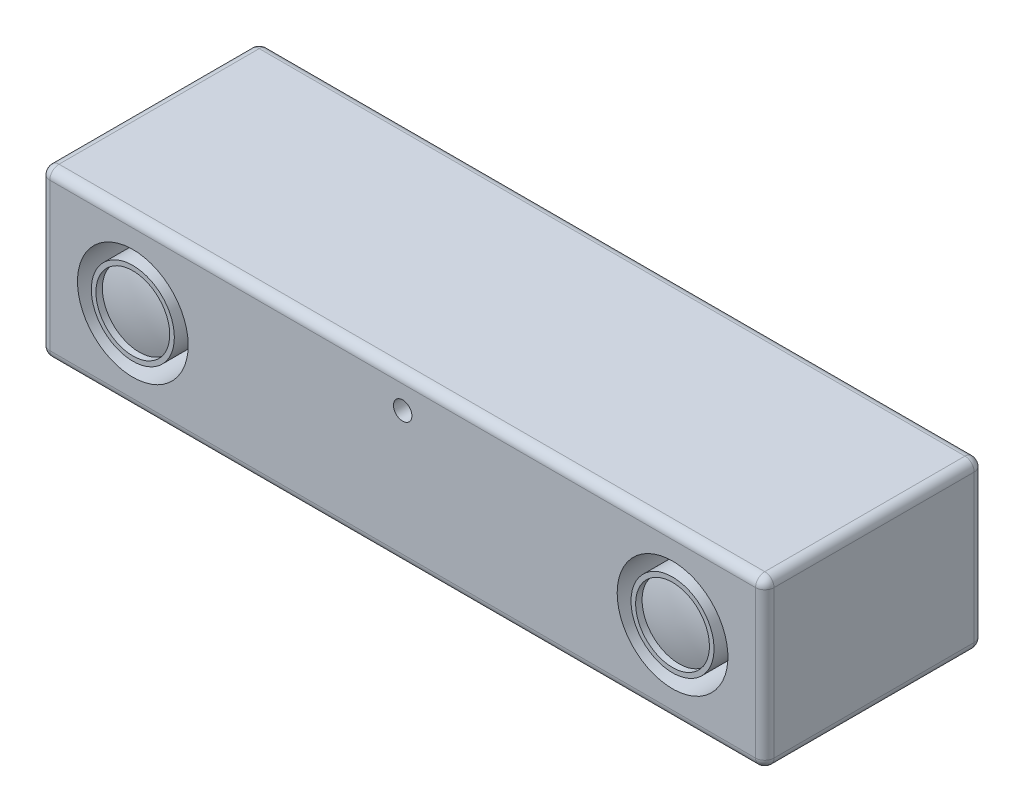
ISO-10303-21;
HEADER;
FILE_DESCRIPTION(('STEP AP214'),'2;1');
FILE_NAME('part.step','',(''),(''),'','','');
FILE_SCHEMA(('AUTOMOTIVE_DESIGN { 1 0 10303 214 1 1 1 1 }'));
ENDSEC;
DATA;
#1=APPLICATION_CONTEXT('core data for automotive mechanical design processes');
#2=APPLICATION_PROTOCOL_DEFINITION('international standard','automotive_design',2000,#1);
#3=PRODUCT_CONTEXT('',#1,'mechanical');
#4=PRODUCT('Part','Part','',(#3));
#5=PRODUCT_RELATED_PRODUCT_CATEGORY('part','',(#4));
#6=PRODUCT_DEFINITION_FORMATION('','',#4);
#7=PRODUCT_DEFINITION_CONTEXT('part definition',#1,'design');
#8=PRODUCT_DEFINITION('design','',#6,#7);
#9=PRODUCT_DEFINITION_SHAPE('','',#8);
#10=(LENGTH_UNIT() NAMED_UNIT(*) SI_UNIT(.MILLI.,.METRE.));
#11=(NAMED_UNIT(*) PLANE_ANGLE_UNIT() SI_UNIT($,.RADIAN.));
#12=(NAMED_UNIT(*) SI_UNIT($,.STERADIAN.) SOLID_ANGLE_UNIT());
#13=UNCERTAINTY_MEASURE_WITH_UNIT(LENGTH_MEASURE(1.E-05),#10,'distance_accuracy_value','');
#14=(GEOMETRIC_REPRESENTATION_CONTEXT(3) GLOBAL_UNCERTAINTY_ASSIGNED_CONTEXT((#13)) GLOBAL_UNIT_ASSIGNED_CONTEXT((#10,
#11,#12)) REPRESENTATION_CONTEXT('',''));
#15=CARTESIAN_POINT('',(0.,0.,0.));
#16=DIRECTION('',(0.,0.,1.));
#17=DIRECTION('',(1.,0.,0.));
#18=AXIS2_PLACEMENT_3D('',#15,#16,#17);
#19=CARTESIAN_POINT('',(78.5,36.,-23.7));
#20=DIRECTION('',(-1.,0.,0.));
#21=DIRECTION('',(0.,0.,1.));
#22=AXIS2_PLACEMENT_3D('',#19,#20,#21);
#23=PLANE('',#22);
#24=DIRECTION('',(0.,-1.,0.));
#25=VECTOR('',#24,1.);
#26=CARTESIAN_POINT('',(78.5,36.,21.7));
#27=LINE('',#26,#25);
#28=CARTESIAN_POINT('',(78.5,34.,21.7));
#29=VERTEX_POINT('',#28);
#30=CARTESIAN_POINT('',(78.5,2.,21.7));
#31=VERTEX_POINT('',#30);
#32=EDGE_CURVE('E283',#29,#31,#27,.T.);
#33=ORIENTED_EDGE('',*,*,#32,.T.);
#34=DIRECTION('',(0.,0.,-1.));
#35=VECTOR('',#34,1.);
#36=CARTESIAN_POINT('',(78.5,2.,-23.7));
#37=LINE('',#36,#35);
#38=CARTESIAN_POINT('',(78.5,2.,-21.7));
#39=VERTEX_POINT('',#38);
#40=EDGE_CURVE('E219',#31,#39,#37,.T.);
#41=ORIENTED_EDGE('',*,*,#40,.T.);
#42=DIRECTION('',(0.,-1.,0.));
#43=VECTOR('',#42,1.);
#44=CARTESIAN_POINT('',(78.5,36.,-21.7));
#45=LINE('',#44,#43);
#46=CARTESIAN_POINT('',(78.5,34.,-21.7));
#47=VERTEX_POINT('',#46);
#48=EDGE_CURVE('E281',#39,#47,#45,.F.);
#49=ORIENTED_EDGE('',*,*,#48,.T.);
#50=DIRECTION('',(0.,0.,-1.));
#51=VECTOR('',#50,1.);
#52=CARTESIAN_POINT('',(78.5,34.,23.7));
#53=LINE('',#52,#51);
#54=EDGE_CURVE('E213',#47,#29,#53,.F.);
#55=ORIENTED_EDGE('',*,*,#54,.T.);
#56=EDGE_LOOP('',(#33,#41,#49,#55));
#57=FACE_BOUND('',#56,.T.);
#58=ADVANCED_FACE('F35',(#57),#23,.F.);
#59=CARTESIAN_POINT('',(-78.5,36.,-23.7));
#60=DIRECTION('',(0.,0.,1.));
#61=DIRECTION('',(1.,0.,0.));
#62=AXIS2_PLACEMENT_3D('',#59,#60,#61);
#63=PLANE('',#62);
#64=DIRECTION('',(-1.,0.,0.));
#65=VECTOR('',#64,1.);
#66=CARTESIAN_POINT('',(-78.5,2.,-23.7));
#67=LINE('',#66,#65);
#68=CARTESIAN_POINT('',(76.5,2.,-23.7));
#69=VERTEX_POINT('',#68);
#70=CARTESIAN_POINT('',(-76.5,2.,-23.7));
#71=VERTEX_POINT('',#70);
#72=EDGE_CURVE('E255',#69,#71,#67,.T.);
#73=ORIENTED_EDGE('',*,*,#72,.T.);
#74=DIRECTION('',(0.,-1.,0.));
#75=VECTOR('',#74,1.);
#76=CARTESIAN_POINT('',(-76.5,36.,-23.7));
#77=LINE('',#76,#75);
#78=CARTESIAN_POINT('',(-76.5,34.,-23.7));
#79=VERTEX_POINT('',#78);
#80=EDGE_CURVE('E252',#71,#79,#77,.F.);
#81=ORIENTED_EDGE('',*,*,#80,.T.);
#82=DIRECTION('',(-1.,0.,0.));
#83=VECTOR('',#82,1.);
#84=CARTESIAN_POINT('',(78.5,34.,-23.7));
#85=LINE('',#84,#83);
#86=CARTESIAN_POINT('',(76.5,34.,-23.7));
#87=VERTEX_POINT('',#86);
#88=EDGE_CURVE('E244',#79,#87,#85,.F.);
#89=ORIENTED_EDGE('',*,*,#88,.T.);
#90=DIRECTION('',(0.,-1.,0.));
#91=VECTOR('',#90,1.);
#92=CARTESIAN_POINT('',(76.5,36.,-23.7));
#93=LINE('',#92,#91);
#94=EDGE_CURVE('E249',#87,#69,#93,.T.);
#95=ORIENTED_EDGE('',*,*,#94,.T.);
#96=EDGE_LOOP('',(#73,#81,#89,#95));
#97=FACE_BOUND('',#96,.T.);
#98=ADVANCED_FACE('F253',(#97),#63,.F.);
#99=CARTESIAN_POINT('',(-78.5,36.,-23.7));
#100=DIRECTION('',(1.,0.,0.));
#101=DIRECTION('',(0.,0.,-1.));
#102=AXIS2_PLACEMENT_3D('',#99,#100,#101);
#103=PLANE('',#102);
#104=DIRECTION('',(0.,0.,1.));
#105=VECTOR('',#104,1.);
#106=CARTESIAN_POINT('',(-78.5,34.,-23.7));
#107=LINE('',#106,#105);
#108=CARTESIAN_POINT('',(-78.5,34.,21.7));
#109=VERTEX_POINT('',#108);
#110=CARTESIAN_POINT('',(-78.5,34.,-21.7));
#111=VERTEX_POINT('',#110);
#112=EDGE_CURVE('E134',#109,#111,#107,.F.);
#113=ORIENTED_EDGE('',*,*,#112,.T.);
#114=DIRECTION('',(0.,-1.,0.));
#115=VECTOR('',#114,1.);
#116=CARTESIAN_POINT('',(-78.5,36.,-21.7));
#117=LINE('',#116,#115);
#118=CARTESIAN_POINT('',(-78.5,2.,-21.7));
#119=VERTEX_POINT('',#118);
#120=EDGE_CURVE('E130',#111,#119,#117,.T.);
#121=ORIENTED_EDGE('',*,*,#120,.T.);
#122=DIRECTION('',(0.,0.,1.));
#123=VECTOR('',#122,1.);
#124=CARTESIAN_POINT('',(-78.5,2.,-23.7));
#125=LINE('',#124,#123);
#126=CARTESIAN_POINT('',(-78.5,2.,21.7));
#127=VERTEX_POINT('',#126);
#128=EDGE_CURVE('E124',#119,#127,#125,.T.);
#129=ORIENTED_EDGE('',*,*,#128,.T.);
#130=DIRECTION('',(0.,-1.,0.));
#131=VECTOR('',#130,1.);
#132=CARTESIAN_POINT('',(-78.5,36.,21.7));
#133=LINE('',#132,#131);
#134=EDGE_CURVE('E127',#127,#109,#133,.F.);
#135=ORIENTED_EDGE('',*,*,#134,.T.);
#136=EDGE_LOOP('',(#113,#121,#129,#135));
#137=FACE_BOUND('',#136,.T.);
#138=ADVANCED_FACE('F126',(#137),#103,.F.);
#139=CARTESIAN_POINT('',(-78.5,36.,23.7));
#140=DIRECTION('',(0.,0.,-1.));
#141=DIRECTION('',(-1.,0.,0.));
#142=AXIS2_PLACEMENT_3D('',#139,#140,#141);
#143=PLANE('',#142);
#144=CARTESIAN_POINT('',(58.5,18.,23.7));
#145=DIRECTION('',(0.,0.,1.));
#146=DIRECTION('',(-1.,0.,0.));
#147=AXIS2_PLACEMENT_3D('',#144,#145,#146);
#148=CIRCLE('',#147,12.);
#149=CARTESIAN_POINT('',(46.5,18.,23.7));
#150=VERTEX_POINT('',#149);
#151=EDGE_CURVE('E680',#150,#150,#148,.T.);
#152=ORIENTED_EDGE('',*,*,#151,.F.);
#153=EDGE_LOOP('',(#152));
#154=FACE_BOUND('',#153,.T.);
#155=CARTESIAN_POINT('',(-58.5,18.,23.7));
#156=DIRECTION('',(0.,0.,1.));
#157=DIRECTION('',(1.,0.,0.));
#158=AXIS2_PLACEMENT_3D('',#155,#156,#157);
#159=CIRCLE('',#158,12.);
#160=CARTESIAN_POINT('',(-46.5,18.,23.7));
#161=VERTEX_POINT('',#160);
#162=EDGE_CURVE('E694',#161,#161,#159,.T.);
#163=ORIENTED_EDGE('',*,*,#162,.F.);
#164=EDGE_LOOP('',(#163));
#165=FACE_BOUND('',#164,.T.);
#166=CARTESIAN_POINT('',(0.,29.,23.7));
#167=DIRECTION('',(0.,0.,1.));
#168=DIRECTION('',(1.,0.,0.));
#169=AXIS2_PLACEMENT_3D('',#166,#167,#168);
#170=CIRCLE('',#169,2.);
#171=CARTESIAN_POINT('',(2.,29.,23.7));
#172=VERTEX_POINT('',#171);
#173=EDGE_CURVE('E674',#172,#172,#170,.T.);
#174=ORIENTED_EDGE('',*,*,#173,.F.);
#175=EDGE_LOOP('',(#174));
#176=FACE_BOUND('',#175,.T.);
#177=DIRECTION('',(0.,-1.,0.));
#178=VECTOR('',#177,1.);
#179=CARTESIAN_POINT('',(-76.5,36.,23.7));
#180=LINE('',#179,#178);
#181=CARTESIAN_POINT('',(-76.5,34.,23.7));
#182=VERTEX_POINT('',#181);
#183=CARTESIAN_POINT('',(-76.5,2.,23.7));
#184=VERTEX_POINT('',#183);
#185=EDGE_CURVE('E275',#182,#184,#180,.T.);
#186=ORIENTED_EDGE('',*,*,#185,.T.);
#187=DIRECTION('',(1.,0.,0.));
#188=VECTOR('',#187,1.);
#189=CARTESIAN_POINT('',(-78.5,2.,23.7));
#190=LINE('',#189,#188);
#191=CARTESIAN_POINT('',(76.5,2.,23.7));
#192=VERTEX_POINT('',#191);
#193=EDGE_CURVE('E277',#184,#192,#190,.T.);
#194=ORIENTED_EDGE('',*,*,#193,.T.);
#195=DIRECTION('',(0.,-1.,0.));
#196=VECTOR('',#195,1.);
#197=CARTESIAN_POINT('',(76.5,36.,23.7));
#198=LINE('',#197,#196);
#199=CARTESIAN_POINT('',(76.5,34.,23.7));
#200=VERTEX_POINT('',#199);
#201=EDGE_CURVE('E273',#192,#200,#198,.F.);
#202=ORIENTED_EDGE('',*,*,#201,.T.);
#203=DIRECTION('',(1.,0.,0.));
#204=VECTOR('',#203,1.);
#205=CARTESIAN_POINT('',(-78.5,34.,23.7));
#206=LINE('',#205,#204);
#207=EDGE_CURVE('E271',#200,#182,#206,.F.);
#208=ORIENTED_EDGE('',*,*,#207,.T.);
#209=EDGE_LOOP('',(#186,#194,#202,#208));
#210=FACE_BOUND('',#209,.T.);
#211=ADVANCED_FACE('F456',(#154,#165,#176,#210),#143,.F.);
#212=CARTESIAN_POINT('',(0.,36.,0.));
#213=DIRECTION('',(0.,1.,0.));
#214=DIRECTION('',(0.,0.,1.));
#215=AXIS2_PLACEMENT_3D('',#212,#213,#214);
#216=PLANE('',#215);
#217=DIRECTION('',(-1.,0.,0.));
#218=VECTOR('',#217,1.);
#219=CARTESIAN_POINT('',(-78.5,36.,-21.7));
#220=LINE('',#219,#218);
#221=CARTESIAN_POINT('',(76.5,36.,-21.7));
#222=VERTEX_POINT('',#221);
#223=CARTESIAN_POINT('',(-76.5,36.,-21.7));
#224=VERTEX_POINT('',#223);
#225=EDGE_CURVE('E44',#222,#224,#220,.T.);
#226=ORIENTED_EDGE('',*,*,#225,.T.);
#227=DIRECTION('',(0.,0.,1.));
#228=VECTOR('',#227,1.);
#229=CARTESIAN_POINT('',(-76.5,36.,23.7));
#230=LINE('',#229,#228);
#231=CARTESIAN_POINT('',(-76.5,36.,21.7));
#232=VERTEX_POINT('',#231);
#233=EDGE_CURVE('E11',#224,#232,#230,.T.);
#234=ORIENTED_EDGE('',*,*,#233,.T.);
#235=DIRECTION('',(1.,0.,0.));
#236=VECTOR('',#235,1.);
#237=CARTESIAN_POINT('',(78.5,36.,21.7));
#238=LINE('',#237,#236);
#239=CARTESIAN_POINT('',(76.5,36.,21.7));
#240=VERTEX_POINT('',#239);
#241=EDGE_CURVE('E216',#232,#240,#238,.T.);
#242=ORIENTED_EDGE('',*,*,#241,.T.);
#243=DIRECTION('',(0.,0.,-1.));
#244=VECTOR('',#243,1.);
#245=CARTESIAN_POINT('',(76.5,36.,-23.7));
#246=LINE('',#245,#244);
#247=EDGE_CURVE('E55',#240,#222,#246,.T.);
#248=ORIENTED_EDGE('',*,*,#247,.T.);
#249=EDGE_LOOP('',(#226,#234,#242,#248));
#250=FACE_BOUND('',#249,.T.);
#251=ADVANCED_FACE('F542',(#250),#216,.T.);
#252=CARTESIAN_POINT('',(0.,0.,0.));
#253=DIRECTION('',(0.,1.,0.));
#254=DIRECTION('',(0.,0.,1.));
#255=AXIS2_PLACEMENT_3D('',#252,#253,#254);
#256=PLANE('',#255);
#257=DIRECTION('',(0.,0.,1.));
#258=VECTOR('',#257,1.);
#259=CARTESIAN_POINT('',(-76.5,0.,0.));
#260=LINE('',#259,#258);
#261=CARTESIAN_POINT('',(-76.5,0.,21.7));
#262=VERTEX_POINT('',#261);
#263=CARTESIAN_POINT('',(-76.5,0.,-21.7));
#264=VERTEX_POINT('',#263);
#265=EDGE_CURVE('E156',#262,#264,#260,.F.);
#266=ORIENTED_EDGE('',*,*,#265,.T.);
#267=DIRECTION('',(-1.,0.,0.));
#268=VECTOR('',#267,1.);
#269=CARTESIAN_POINT('',(0.,0.,-21.7));
#270=LINE('',#269,#268);
#271=CARTESIAN_POINT('',(76.5,0.,-21.7));
#272=VERTEX_POINT('',#271);
#273=EDGE_CURVE('E268',#264,#272,#270,.F.);
#274=ORIENTED_EDGE('',*,*,#273,.T.);
#275=DIRECTION('',(0.,0.,-1.));
#276=VECTOR('',#275,1.);
#277=CARTESIAN_POINT('',(76.5,0.,0.));
#278=LINE('',#277,#276);
#279=CARTESIAN_POINT('',(76.5,0.,21.7));
#280=VERTEX_POINT('',#279);
#281=EDGE_CURVE('E259',#272,#280,#278,.F.);
#282=ORIENTED_EDGE('',*,*,#281,.T.);
#283=DIRECTION('',(1.,0.,0.));
#284=VECTOR('',#283,1.);
#285=CARTESIAN_POINT('',(0.,0.,21.7));
#286=LINE('',#285,#284);
#287=EDGE_CURVE('E261',#280,#262,#286,.F.);
#288=ORIENTED_EDGE('',*,*,#287,.T.);
#289=EDGE_LOOP('',(#266,#274,#282,#288));
#290=FACE_BOUND('',#289,.T.);
#291=ADVANCED_FACE('F556',(#290),#256,.F.);
#292=CARTESIAN_POINT('',(76.5,36.,21.7));
#293=DIRECTION('',(0.,-1.,0.));
#294=DIRECTION('',(0.,0.,-1.));
#295=AXIS2_PLACEMENT_3D('',#292,#293,#294);
#296=CYLINDRICAL_SURFACE('',#295,2.);
#297=CARTESIAN_POINT('',(76.5,34.,21.7));
#298=DIRECTION('',(0.,1.,0.));
#299=DIRECTION('',(0.,0.,1.));
#300=AXIS2_PLACEMENT_3D('',#297,#298,#299);
#301=CIRCLE('',#300,2.);
#302=EDGE_CURVE('E39',#200,#29,#301,.T.);
#303=ORIENTED_EDGE('',*,*,#302,.F.);
#304=ORIENTED_EDGE('',*,*,#201,.F.);
#305=CARTESIAN_POINT('',(76.5,2.,21.7));
#306=DIRECTION('',(0.,-1.,0.));
#307=DIRECTION('',(0.,0.,-1.));
#308=AXIS2_PLACEMENT_3D('',#305,#306,#307);
#309=CIRCLE('',#308,2.);
#310=EDGE_CURVE('E194',#31,#192,#309,.T.);
#311=ORIENTED_EDGE('',*,*,#310,.F.);
#312=ORIENTED_EDGE('',*,*,#32,.F.);
#313=EDGE_LOOP('',(#303,#304,#311,#312));
#314=FACE_BOUND('',#313,.T.);
#315=ADVANCED_FACE('F37',(#314),#296,.T.);
#316=CARTESIAN_POINT('',(76.5,34.,21.7));
#317=DIRECTION('',(0.,0.,1.));
#318=DIRECTION('',(1.,0.,0.));
#319=AXIS2_PLACEMENT_3D('',#316,#317,#318);
#320=SPHERICAL_SURFACE('',#319,2.);
#321=CARTESIAN_POINT('',(76.5,34.,21.7));
#322=DIRECTION('',(1.,0.,0.));
#323=DIRECTION('',(0.,0.,-1.));
#324=AXIS2_PLACEMENT_3D('',#321,#322,#323);
#325=CIRCLE('',#324,2.);
#326=EDGE_CURVE('E189',#200,#240,#325,.F.);
#327=ORIENTED_EDGE('',*,*,#326,.F.);
#328=ORIENTED_EDGE('',*,*,#302,.T.);
#329=CARTESIAN_POINT('',(76.5,34.,21.7));
#330=DIRECTION('',(0.,0.,1.));
#331=DIRECTION('',(1.,0.,0.));
#332=AXIS2_PLACEMENT_3D('',#329,#330,#331);
#333=CIRCLE('',#332,2.);
#334=EDGE_CURVE('E192',#240,#29,#333,.F.);
#335=ORIENTED_EDGE('',*,*,#334,.F.);
#336=EDGE_LOOP('',(#327,#328,#335));
#337=FACE_BOUND('',#336,.T.);
#338=ADVANCED_FACE('F206',(#337),#320,.T.);
#339=CARTESIAN_POINT('',(76.5,2.,21.7));
#340=DIRECTION('',(0.,0.,1.));
#341=DIRECTION('',(1.,0.,0.));
#342=AXIS2_PLACEMENT_3D('',#339,#340,#341);
#343=SPHERICAL_SURFACE('',#342,2.);
#344=CARTESIAN_POINT('',(76.5,2.,21.7));
#345=DIRECTION('',(0.,0.,1.));
#346=DIRECTION('',(1.,0.,0.));
#347=AXIS2_PLACEMENT_3D('',#344,#345,#346);
#348=CIRCLE('',#347,2.);
#349=EDGE_CURVE('E184',#31,#280,#348,.F.);
#350=ORIENTED_EDGE('',*,*,#349,.F.);
#351=ORIENTED_EDGE('',*,*,#310,.T.);
#352=CARTESIAN_POINT('',(76.5,2.,21.7));
#353=DIRECTION('',(1.,0.,0.));
#354=DIRECTION('',(0.,0.,-1.));
#355=AXIS2_PLACEMENT_3D('',#352,#353,#354);
#356=CIRCLE('',#355,2.);
#357=EDGE_CURVE('E187',#280,#192,#356,.F.);
#358=ORIENTED_EDGE('',*,*,#357,.F.);
#359=EDGE_LOOP('',(#350,#351,#358));
#360=FACE_BOUND('',#359,.T.);
#361=ADVANCED_FACE('F574',(#360),#343,.T.);
#362=CARTESIAN_POINT('',(76.5,34.,0.));
#363=DIRECTION('',(0.,0.,1.));
#364=DIRECTION('',(1.,0.,0.));
#365=AXIS2_PLACEMENT_3D('',#362,#363,#364);
#366=CYLINDRICAL_SURFACE('',#365,2.);
#367=ORIENTED_EDGE('',*,*,#334,.T.);
#368=ORIENTED_EDGE('',*,*,#54,.F.);
#369=CARTESIAN_POINT('',(76.5,34.,-21.7));
#370=DIRECTION('',(0.,0.,-1.));
#371=DIRECTION('',(-1.,0.,0.));
#372=AXIS2_PLACEMENT_3D('',#369,#370,#371);
#373=CIRCLE('',#372,2.);
#374=EDGE_CURVE('E178',#222,#47,#373,.T.);
#375=ORIENTED_EDGE('',*,*,#374,.F.);
#376=ORIENTED_EDGE('',*,*,#247,.F.);
#377=EDGE_LOOP('',(#367,#368,#375,#376));
#378=FACE_BOUND('',#377,.T.);
#379=ADVANCED_FACE('F212',(#378),#366,.T.);
#380=CARTESIAN_POINT('',(0.,34.,21.7));
#381=DIRECTION('',(-1.,0.,0.));
#382=DIRECTION('',(0.,0.,1.));
#383=AXIS2_PLACEMENT_3D('',#380,#381,#382);
#384=CYLINDRICAL_SURFACE('',#383,2.);
#385=ORIENTED_EDGE('',*,*,#326,.T.);
#386=ORIENTED_EDGE('',*,*,#241,.F.);
#387=CARTESIAN_POINT('',(-76.5,34.,21.7));
#388=DIRECTION('',(-1.,0.,0.));
#389=DIRECTION('',(0.,0.,1.));
#390=AXIS2_PLACEMENT_3D('',#387,#388,#389);
#391=CIRCLE('',#390,2.);
#392=EDGE_CURVE('E175',#182,#232,#391,.T.);
#393=ORIENTED_EDGE('',*,*,#392,.F.);
#394=ORIENTED_EDGE('',*,*,#207,.F.);
#395=EDGE_LOOP('',(#385,#386,#393,#394));
#396=FACE_BOUND('',#395,.T.);
#397=ADVANCED_FACE('F586',(#396),#384,.T.);
#398=CARTESIAN_POINT('',(-76.5,36.,21.7));
#399=DIRECTION('',(0.,-1.,0.));
#400=DIRECTION('',(0.,0.,-1.));
#401=AXIS2_PLACEMENT_3D('',#398,#399,#400);
#402=CYLINDRICAL_SURFACE('',#401,2.);
#403=CARTESIAN_POINT('',(-76.5,2.,21.7));
#404=DIRECTION('',(0.,-1.,0.));
#405=DIRECTION('',(0.,0.,-1.));
#406=AXIS2_PLACEMENT_3D('',#403,#404,#405);
#407=CIRCLE('',#406,2.);
#408=EDGE_CURVE('E141',#184,#127,#407,.T.);
#409=ORIENTED_EDGE('',*,*,#408,.F.);
#410=ORIENTED_EDGE('',*,*,#185,.F.);
#411=CARTESIAN_POINT('',(-76.5,34.,21.7));
#412=DIRECTION('',(0.,1.,0.));
#413=DIRECTION('',(0.,0.,1.));
#414=AXIS2_PLACEMENT_3D('',#411,#412,#413);
#415=CIRCLE('',#414,2.);
#416=EDGE_CURVE('E144',#109,#182,#415,.T.);
#417=ORIENTED_EDGE('',*,*,#416,.F.);
#418=ORIENTED_EDGE('',*,*,#134,.F.);
#419=EDGE_LOOP('',(#409,#410,#417,#418));
#420=FACE_BOUND('',#419,.T.);
#421=ADVANCED_FACE('F139',(#420),#402,.T.);
#422=CARTESIAN_POINT('',(-78.5,2.,21.7));
#423=DIRECTION('',(1.,0.,0.));
#424=DIRECTION('',(0.,0.,-1.));
#425=AXIS2_PLACEMENT_3D('',#422,#423,#424);
#426=CYLINDRICAL_SURFACE('',#425,2.);
#427=ORIENTED_EDGE('',*,*,#357,.T.);
#428=ORIENTED_EDGE('',*,*,#193,.F.);
#429=CARTESIAN_POINT('',(-76.5,2.,21.7));
#430=DIRECTION('',(-1.,0.,0.));
#431=DIRECTION('',(0.,0.,1.));
#432=AXIS2_PLACEMENT_3D('',#429,#430,#431);
#433=CIRCLE('',#432,2.);
#434=EDGE_CURVE('E153',#262,#184,#433,.T.);
#435=ORIENTED_EDGE('',*,*,#434,.F.);
#436=ORIENTED_EDGE('',*,*,#287,.F.);
#437=EDGE_LOOP('',(#427,#428,#435,#436));
#438=FACE_BOUND('',#437,.T.);
#439=ADVANCED_FACE('F600',(#438),#426,.T.);
#440=CARTESIAN_POINT('',(76.5,2.,-23.7));
#441=DIRECTION('',(0.,0.,-1.));
#442=DIRECTION('',(-1.,0.,0.));
#443=AXIS2_PLACEMENT_3D('',#440,#441,#442);
#444=CYLINDRICAL_SURFACE('',#443,2.);
#445=ORIENTED_EDGE('',*,*,#349,.T.);
#446=ORIENTED_EDGE('',*,*,#281,.F.);
#447=CARTESIAN_POINT('',(76.5,2.,-21.7));
#448=DIRECTION('',(0.,0.,-1.));
#449=DIRECTION('',(-1.,0.,0.));
#450=AXIS2_PLACEMENT_3D('',#447,#448,#449);
#451=CIRCLE('',#450,2.);
#452=EDGE_CURVE('E170',#39,#272,#451,.T.);
#453=ORIENTED_EDGE('',*,*,#452,.F.);
#454=ORIENTED_EDGE('',*,*,#40,.F.);
#455=EDGE_LOOP('',(#445,#446,#453,#454));
#456=FACE_BOUND('',#455,.T.);
#457=ADVANCED_FACE('F290',(#456),#444,.T.);
#458=CARTESIAN_POINT('',(76.5,36.,-21.7));
#459=DIRECTION('',(0.,-1.,0.));
#460=DIRECTION('',(0.,0.,-1.));
#461=AXIS2_PLACEMENT_3D('',#458,#459,#460);
#462=CYLINDRICAL_SURFACE('',#461,2.);
#463=CARTESIAN_POINT('',(76.5,34.,-21.7));
#464=DIRECTION('',(0.,1.,0.));
#465=DIRECTION('',(0.,0.,1.));
#466=AXIS2_PLACEMENT_3D('',#463,#464,#465);
#467=CIRCLE('',#466,2.);
#468=EDGE_CURVE('E181',#47,#87,#467,.T.);
#469=ORIENTED_EDGE('',*,*,#468,.F.);
#470=ORIENTED_EDGE('',*,*,#48,.F.);
#471=CARTESIAN_POINT('',(76.5,2.,-21.7));
#472=DIRECTION('',(0.,-1.,0.));
#473=DIRECTION('',(0.,0.,-1.));
#474=AXIS2_PLACEMENT_3D('',#471,#472,#473);
#475=CIRCLE('',#474,2.);
#476=EDGE_CURVE('E168',#69,#39,#475,.T.);
#477=ORIENTED_EDGE('',*,*,#476,.F.);
#478=ORIENTED_EDGE('',*,*,#94,.F.);
#479=EDGE_LOOP('',(#469,#470,#477,#478));
#480=FACE_BOUND('',#479,.T.);
#481=ADVANCED_FACE('F296',(#480),#462,.T.);
#482=CARTESIAN_POINT('',(76.5,34.,-21.7));
#483=DIRECTION('',(0.,0.,1.));
#484=DIRECTION('',(1.,0.,0.));
#485=AXIS2_PLACEMENT_3D('',#482,#483,#484);
#486=SPHERICAL_SURFACE('',#485,2.);
#487=ORIENTED_EDGE('',*,*,#374,.T.);
#488=ORIENTED_EDGE('',*,*,#468,.T.);
#489=CARTESIAN_POINT('',(76.5,34.,-21.7));
#490=DIRECTION('',(1.,0.,0.));
#491=DIRECTION('',(0.,0.,-1.));
#492=AXIS2_PLACEMENT_3D('',#489,#490,#491);
#493=CIRCLE('',#492,2.);
#494=EDGE_CURVE('E160',#222,#87,#493,.F.);
#495=ORIENTED_EDGE('',*,*,#494,.F.);
#496=EDGE_LOOP('',(#487,#488,#495));
#497=FACE_BOUND('',#496,.T.);
#498=ADVANCED_FACE('F298',(#497),#486,.T.);
#499=CARTESIAN_POINT('',(-76.5,34.,21.7));
#500=DIRECTION('',(0.,0.,1.));
#501=DIRECTION('',(1.,0.,0.));
#502=AXIS2_PLACEMENT_3D('',#499,#500,#501);
#503=SPHERICAL_SURFACE('',#502,2.);
#504=ORIENTED_EDGE('',*,*,#416,.T.);
#505=ORIENTED_EDGE('',*,*,#392,.T.);
#506=CARTESIAN_POINT('',(-76.5,34.,21.7));
#507=DIRECTION('',(0.,0.,1.));
#508=DIRECTION('',(1.,0.,0.));
#509=AXIS2_PLACEMENT_3D('',#506,#507,#508);
#510=CIRCLE('',#509,2.);
#511=EDGE_CURVE('E157',#109,#232,#510,.F.);
#512=ORIENTED_EDGE('',*,*,#511,.F.);
#513=EDGE_LOOP('',(#504,#505,#512));
#514=FACE_BOUND('',#513,.T.);
#515=ADVANCED_FACE('F300',(#514),#503,.T.);
#516=CARTESIAN_POINT('',(-76.5,2.,21.7));
#517=DIRECTION('',(0.,0.,1.));
#518=DIRECTION('',(1.,0.,0.));
#519=AXIS2_PLACEMENT_3D('',#516,#517,#518);
#520=SPHERICAL_SURFACE('',#519,2.);
#521=ORIENTED_EDGE('',*,*,#434,.T.);
#522=ORIENTED_EDGE('',*,*,#408,.T.);
#523=CARTESIAN_POINT('',(-76.5,2.,21.7));
#524=DIRECTION('',(0.,0.,1.));
#525=DIRECTION('',(1.,0.,0.));
#526=AXIS2_PLACEMENT_3D('',#523,#524,#525);
#527=CIRCLE('',#526,2.);
#528=EDGE_CURVE('E150',#262,#127,#527,.F.);
#529=ORIENTED_EDGE('',*,*,#528,.F.);
#530=EDGE_LOOP('',(#521,#522,#529));
#531=FACE_BOUND('',#530,.T.);
#532=ADVANCED_FACE('F149',(#531),#520,.T.);
#533=CARTESIAN_POINT('',(76.5,2.,-21.7));
#534=DIRECTION('',(0.,0.,1.));
#535=DIRECTION('',(1.,0.,0.));
#536=AXIS2_PLACEMENT_3D('',#533,#534,#535);
#537=SPHERICAL_SURFACE('',#536,2.);
#538=ORIENTED_EDGE('',*,*,#476,.T.);
#539=ORIENTED_EDGE('',*,*,#452,.T.);
#540=CARTESIAN_POINT('',(76.5,2.,-21.7));
#541=DIRECTION('',(1.,0.,0.));
#542=DIRECTION('',(0.,0.,-1.));
#543=AXIS2_PLACEMENT_3D('',#540,#541,#542);
#544=CIRCLE('',#543,2.);
#545=EDGE_CURVE('E158',#69,#272,#544,.F.);
#546=ORIENTED_EDGE('',*,*,#545,.F.);
#547=EDGE_LOOP('',(#538,#539,#546));
#548=FACE_BOUND('',#547,.T.);
#549=ADVANCED_FACE('F339',(#548),#537,.T.);
#550=CARTESIAN_POINT('',(0.,34.,-21.7));
#551=DIRECTION('',(1.,0.,0.));
#552=DIRECTION('',(0.,0.,-1.));
#553=AXIS2_PLACEMENT_3D('',#550,#551,#552);
#554=CYLINDRICAL_SURFACE('',#553,2.);
#555=ORIENTED_EDGE('',*,*,#494,.T.);
#556=ORIENTED_EDGE('',*,*,#88,.F.);
#557=CARTESIAN_POINT('',(-76.5,34.,-21.7));
#558=DIRECTION('',(-1.,0.,0.));
#559=DIRECTION('',(0.,0.,1.));
#560=AXIS2_PLACEMENT_3D('',#557,#558,#559);
#561=CIRCLE('',#560,2.);
#562=EDGE_CURVE('E162',#224,#79,#561,.T.);
#563=ORIENTED_EDGE('',*,*,#562,.F.);
#564=ORIENTED_EDGE('',*,*,#225,.F.);
#565=EDGE_LOOP('',(#555,#556,#563,#564));
#566=FACE_BOUND('',#565,.T.);
#567=ADVANCED_FACE('F246',(#566),#554,.T.);
#568=CARTESIAN_POINT('',(-76.5,34.,0.));
#569=DIRECTION('',(0.,0.,-1.));
#570=DIRECTION('',(-1.,0.,0.));
#571=AXIS2_PLACEMENT_3D('',#568,#569,#570);
#572=CYLINDRICAL_SURFACE('',#571,2.);
#573=ORIENTED_EDGE('',*,*,#511,.T.);
#574=ORIENTED_EDGE('',*,*,#233,.F.);
#575=CARTESIAN_POINT('',(-76.5,34.,-21.7));
#576=DIRECTION('',(0.,0.,-1.));
#577=DIRECTION('',(-1.,0.,0.));
#578=AXIS2_PLACEMENT_3D('',#575,#576,#577);
#579=CIRCLE('',#578,2.);
#580=EDGE_CURVE('E234',#111,#224,#579,.T.);
#581=ORIENTED_EDGE('',*,*,#580,.F.);
#582=ORIENTED_EDGE('',*,*,#112,.F.);
#583=EDGE_LOOP('',(#573,#574,#581,#582));
#584=FACE_BOUND('',#583,.T.);
#585=ADVANCED_FACE('F333',(#584),#572,.T.);
#586=CARTESIAN_POINT('',(-76.5,2.,-23.7));
#587=DIRECTION('',(0.,0.,1.));
#588=DIRECTION('',(1.,0.,0.));
#589=AXIS2_PLACEMENT_3D('',#586,#587,#588);
#590=CYLINDRICAL_SURFACE('',#589,2.);
#591=ORIENTED_EDGE('',*,*,#528,.T.);
#592=ORIENTED_EDGE('',*,*,#128,.F.);
#593=CARTESIAN_POINT('',(-76.5,2.,-21.7));
#594=DIRECTION('',(0.,0.,-1.));
#595=DIRECTION('',(-1.,0.,0.));
#596=AXIS2_PLACEMENT_3D('',#593,#594,#595);
#597=CIRCLE('',#596,2.);
#598=EDGE_CURVE('E231',#264,#119,#597,.T.);
#599=ORIENTED_EDGE('',*,*,#598,.F.);
#600=ORIENTED_EDGE('',*,*,#265,.F.);
#601=EDGE_LOOP('',(#591,#592,#599,#600));
#602=FACE_BOUND('',#601,.T.);
#603=ADVANCED_FACE('F155',(#602),#590,.T.);
#604=CARTESIAN_POINT('',(-78.5,2.,-21.7));
#605=DIRECTION('',(-1.,0.,0.));
#606=DIRECTION('',(0.,0.,1.));
#607=AXIS2_PLACEMENT_3D('',#604,#605,#606);
#608=CYLINDRICAL_SURFACE('',#607,2.);
#609=ORIENTED_EDGE('',*,*,#545,.T.);
#610=ORIENTED_EDGE('',*,*,#273,.F.);
#611=CARTESIAN_POINT('',(-76.5,2.,-21.7));
#612=DIRECTION('',(-1.,0.,0.));
#613=DIRECTION('',(0.,0.,1.));
#614=AXIS2_PLACEMENT_3D('',#611,#612,#613);
#615=CIRCLE('',#614,2.);
#616=EDGE_CURVE('E228',#71,#264,#615,.T.);
#617=ORIENTED_EDGE('',*,*,#616,.F.);
#618=ORIENTED_EDGE('',*,*,#72,.F.);
#619=EDGE_LOOP('',(#609,#610,#617,#618));
#620=FACE_BOUND('',#619,.T.);
#621=ADVANCED_FACE('F327',(#620),#608,.T.);
#622=CARTESIAN_POINT('',(-76.5,34.,-21.7));
#623=DIRECTION('',(0.,0.,1.));
#624=DIRECTION('',(1.,0.,0.));
#625=AXIS2_PLACEMENT_3D('',#622,#623,#624);
#626=SPHERICAL_SURFACE('',#625,2.);
#627=ORIENTED_EDGE('',*,*,#580,.T.);
#628=ORIENTED_EDGE('',*,*,#562,.T.);
#629=CARTESIAN_POINT('',(-76.5,34.,-21.7));
#630=DIRECTION('',(0.,1.,0.));
#631=DIRECTION('',(0.,0.,1.));
#632=AXIS2_PLACEMENT_3D('',#629,#630,#631);
#633=CIRCLE('',#632,2.);
#634=EDGE_CURVE('E225',#111,#79,#633,.F.);
#635=ORIENTED_EDGE('',*,*,#634,.F.);
#636=EDGE_LOOP('',(#627,#628,#635));
#637=FACE_BOUND('',#636,.T.);
#638=ADVANCED_FACE('F241',(#637),#626,.T.);
#639=CARTESIAN_POINT('',(-76.5,2.,-21.7));
#640=DIRECTION('',(0.,0.,1.));
#641=DIRECTION('',(1.,0.,0.));
#642=AXIS2_PLACEMENT_3D('',#639,#640,#641);
#643=SPHERICAL_SURFACE('',#642,2.);
#644=ORIENTED_EDGE('',*,*,#616,.T.);
#645=ORIENTED_EDGE('',*,*,#598,.T.);
#646=CARTESIAN_POINT('',(-76.5,2.,-21.7));
#647=DIRECTION('',(0.,-1.,0.));
#648=DIRECTION('',(0.,0.,-1.));
#649=AXIS2_PLACEMENT_3D('',#646,#647,#648);
#650=CIRCLE('',#649,2.);
#651=EDGE_CURVE('E223',#71,#119,#650,.F.);
#652=ORIENTED_EDGE('',*,*,#651,.F.);
#653=EDGE_LOOP('',(#644,#645,#652));
#654=FACE_BOUND('',#653,.T.);
#655=ADVANCED_FACE('F321',(#654),#643,.T.);
#656=CARTESIAN_POINT('',(-76.5,36.,-21.7));
#657=DIRECTION('',(0.,-1.,0.));
#658=DIRECTION('',(0.,0.,-1.));
#659=AXIS2_PLACEMENT_3D('',#656,#657,#658);
#660=CYLINDRICAL_SURFACE('',#659,2.);
#661=ORIENTED_EDGE('',*,*,#634,.T.);
#662=ORIENTED_EDGE('',*,*,#80,.F.);
#663=ORIENTED_EDGE('',*,*,#651,.T.);
#664=ORIENTED_EDGE('',*,*,#120,.F.);
#665=EDGE_LOOP('',(#661,#662,#663,#664));
#666=FACE_BOUND('',#665,.T.);
#667=ADVANCED_FACE('F317',(#666),#660,.T.);
#668=CARTESIAN_POINT('',(0.,29.,3.7));
#669=DIRECTION('',(0.,0.,1.));
#670=DIRECTION('',(1.,0.,0.));
#671=AXIS2_PLACEMENT_3D('',#668,#669,#670);
#672=CYLINDRICAL_SURFACE('',#671,2.);
#673=CARTESIAN_POINT('',(0.,29.,3.7));
#674=DIRECTION('',(0.,0.,1.));
#675=DIRECTION('',(1.,0.,0.));
#676=AXIS2_PLACEMENT_3D('',#673,#674,#675);
#677=CIRCLE('',#676,2.);
#678=CARTESIAN_POINT('',(2.,29.,3.7));
#679=VERTEX_POINT('',#678);
#680=EDGE_CURVE('E226',#679,#679,#677,.T.);
#681=ORIENTED_EDGE('',*,*,#680,.F.);
#682=EDGE_LOOP('',(#681));
#683=FACE_BOUND('',#682,.T.);
#684=ORIENTED_EDGE('',*,*,#173,.T.);
#685=EDGE_LOOP('',(#684));
#686=FACE_BOUND('',#685,.T.);
#687=ADVANCED_FACE('F320',(#683,#686),#672,.F.);
#688=CARTESIAN_POINT('',(0.,29.,3.7));
#689=DIRECTION('',(0.,0.,1.));
#690=DIRECTION('',(1.,0.,0.));
#691=AXIS2_PLACEMENT_3D('',#688,#689,#690);
#692=PLANE('',#691);
#693=ORIENTED_EDGE('',*,*,#680,.T.);
#694=EDGE_LOOP('',(#693));
#695=FACE_BOUND('',#694,.T.);
#696=ADVANCED_FACE('F386',(#695),#692,.T.);
#697=CARTESIAN_POINT('',(-58.5,18.,3.7));
#698=DIRECTION('',(0.,0.,1.));
#699=DIRECTION('',(1.,0.,0.));
#700=AXIS2_PLACEMENT_3D('',#697,#698,#699);
#701=CYLINDRICAL_SURFACE('',#700,12.);
#702=CARTESIAN_POINT('',(-58.5,18.,3.7));
#703=DIRECTION('',(0.,0.,1.));
#704=DIRECTION('',(1.,0.,0.));
#705=AXIS2_PLACEMENT_3D('',#702,#703,#704);
#706=CIRCLE('',#705,12.);
#707=CARTESIAN_POINT('',(-46.5,18.,3.7));
#708=VERTEX_POINT('',#707);
#709=EDGE_CURVE('E677',#708,#708,#706,.T.);
#710=ORIENTED_EDGE('',*,*,#709,.F.);
#711=EDGE_LOOP('',(#710));
#712=FACE_BOUND('',#711,.T.);
#713=ORIENTED_EDGE('',*,*,#162,.T.);
#714=EDGE_LOOP('',(#713));
#715=FACE_BOUND('',#714,.T.);
#716=ADVANCED_FACE('F396',(#712,#715),#701,.F.);
#717=CARTESIAN_POINT('',(-58.5,18.,3.7));
#718=DIRECTION('',(0.,0.,1.));
#719=DIRECTION('',(1.,0.,0.));
#720=AXIS2_PLACEMENT_3D('',#717,#718,#719);
#721=PLANE('',#720);
#722=CARTESIAN_POINT('',(-58.5,18.,3.7));
#723=DIRECTION('',(0.,0.,1.));
#724=DIRECTION('',(1.,0.,0.));
#725=AXIS2_PLACEMENT_3D('',#722,#723,#724);
#726=CIRCLE('',#725,9.);
#727=CARTESIAN_POINT('',(-49.5,18.,3.7));
#728=VERTEX_POINT('',#727);
#729=EDGE_CURVE('E697',#728,#728,#726,.T.);
#730=ORIENTED_EDGE('',*,*,#729,.F.);
#731=EDGE_LOOP('',(#730));
#732=FACE_BOUND('',#731,.T.);
#733=ORIENTED_EDGE('',*,*,#709,.T.);
#734=EDGE_LOOP('',(#733));
#735=FACE_BOUND('',#734,.T.);
#736=ADVANCED_FACE('F404',(#732,#735),#721,.T.);
#737=CARTESIAN_POINT('',(-58.5,18.,3.7));
#738=DIRECTION('',(0.,0.,1.));
#739=DIRECTION('',(1.,0.,0.));
#740=AXIS2_PLACEMENT_3D('',#737,#738,#739);
#741=CYLINDRICAL_SURFACE('',#740,9.);
#742=ORIENTED_EDGE('',*,*,#729,.T.);
#743=EDGE_LOOP('',(#742));
#744=FACE_BOUND('',#743,.T.);
#745=CARTESIAN_POINT('',(-58.5,18.,23.7));
#746=DIRECTION('',(0.,0.,1.));
#747=DIRECTION('',(1.,0.,0.));
#748=AXIS2_PLACEMENT_3D('',#745,#746,#747);
#749=CIRCLE('',#748,9.);
#750=CARTESIAN_POINT('',(-49.5,18.,23.7));
#751=VERTEX_POINT('',#750);
#752=EDGE_CURVE('E687',#751,#751,#749,.T.);
#753=ORIENTED_EDGE('',*,*,#752,.F.);
#754=EDGE_LOOP('',(#753));
#755=FACE_BOUND('',#754,.T.);
#756=ADVANCED_FACE('F412',(#744,#755),#741,.T.);
#757=CARTESIAN_POINT('',(58.5,18.,3.7));
#758=DIRECTION('',(0.,0.,1.));
#759=DIRECTION('',(1.,0.,0.));
#760=AXIS2_PLACEMENT_3D('',#757,#758,#759);
#761=CYLINDRICAL_SURFACE('',#760,12.);
#762=CARTESIAN_POINT('',(58.5,18.,3.7));
#763=DIRECTION('',(0.,0.,1.));
#764=DIRECTION('',(-1.,0.,0.));
#765=AXIS2_PLACEMENT_3D('',#762,#763,#764);
#766=CIRCLE('',#765,12.);
#767=CARTESIAN_POINT('',(46.5,18.,3.7));
#768=VERTEX_POINT('',#767);
#769=EDGE_CURVE('E683',#768,#768,#766,.T.);
#770=ORIENTED_EDGE('',*,*,#769,.F.);
#771=EDGE_LOOP('',(#770));
#772=FACE_BOUND('',#771,.T.);
#773=ORIENTED_EDGE('',*,*,#151,.T.);
#774=EDGE_LOOP('',(#773));
#775=FACE_BOUND('',#774,.T.);
#776=ADVANCED_FACE('F421',(#772,#775),#761,.F.);
#777=CARTESIAN_POINT('',(58.5,18.,3.7));
#778=DIRECTION('',(0.,0.,-1.));
#779=DIRECTION('',(-1.,0.,0.));
#780=AXIS2_PLACEMENT_3D('',#777,#778,#779);
#781=PLANE('',#780);
#782=CARTESIAN_POINT('',(58.5,18.,3.7));
#783=DIRECTION('',(0.,0.,1.));
#784=DIRECTION('',(-1.,0.,0.));
#785=AXIS2_PLACEMENT_3D('',#782,#783,#784);
#786=CIRCLE('',#785,9.);
#787=CARTESIAN_POINT('',(49.5,18.,3.7));
#788=VERTEX_POINT('',#787);
#789=EDGE_CURVE('E684',#788,#788,#786,.T.);
#790=ORIENTED_EDGE('',*,*,#789,.F.);
#791=EDGE_LOOP('',(#790));
#792=FACE_BOUND('',#791,.T.);
#793=ORIENTED_EDGE('',*,*,#769,.T.);
#794=EDGE_LOOP('',(#793));
#795=FACE_BOUND('',#794,.T.);
#796=ADVANCED_FACE('F430',(#792,#795),#781,.F.);
#797=CARTESIAN_POINT('',(58.5,18.,3.7));
#798=DIRECTION('',(0.,0.,1.));
#799=DIRECTION('',(1.,0.,0.));
#800=AXIS2_PLACEMENT_3D('',#797,#798,#799);
#801=CYLINDRICAL_SURFACE('',#800,9.);
#802=ORIENTED_EDGE('',*,*,#789,.T.);
#803=EDGE_LOOP('',(#802));
#804=FACE_BOUND('',#803,.T.);
#805=CARTESIAN_POINT('',(58.5,18.,23.7));
#806=DIRECTION('',(0.,0.,1.));
#807=DIRECTION('',(-1.,0.,0.));
#808=AXIS2_PLACEMENT_3D('',#805,#806,#807);
#809=CIRCLE('',#808,9.);
#810=CARTESIAN_POINT('',(49.5,18.,23.7));
#811=VERTEX_POINT('',#810);
#812=EDGE_CURVE('E688',#811,#811,#809,.T.);
#813=ORIENTED_EDGE('',*,*,#812,.F.);
#814=EDGE_LOOP('',(#813));
#815=FACE_BOUND('',#814,.T.);
#816=ADVANCED_FACE('F438',(#804,#815),#801,.T.);
#817=CARTESIAN_POINT('',(-58.5,18.,23.7));
#818=DIRECTION('',(0.,0.,1.));
#819=DIRECTION('',(0.,-1.,0.));
#820=AXIS2_PLACEMENT_3D('',#817,#818,#819);
#821=CIRCLE('',#820,8.);
#822=CARTESIAN_POINT('',(-58.5,9.99999999999999,23.7));
#823=VERTEX_POINT('',#822);
#824=EDGE_CURVE('E691',#823,#823,#821,.T.);
#825=ORIENTED_EDGE('',*,*,#824,.F.);
#826=EDGE_LOOP('',(#825));
#827=FACE_BOUND('',#826,.T.);
#828=ORIENTED_EDGE('',*,*,#752,.T.);
#829=EDGE_LOOP('',(#828));
#830=FACE_BOUND('',#829,.T.);
#831=ADVANCED_FACE('F446',(#827,#830),#143,.F.);
#832=CARTESIAN_POINT('',(58.5,18.,23.7));
#833=DIRECTION('',(0.,0.,-1.));
#834=DIRECTION('',(0.,-1.,0.));
#835=AXIS2_PLACEMENT_3D('',#832,#833,#834);
#836=CIRCLE('',#835,8.);
#837=CARTESIAN_POINT('',(58.5,9.99999999999999,23.7));
#838=VERTEX_POINT('',#837);
#839=EDGE_CURVE('E709',#838,#838,#836,.T.);
#840=ORIENTED_EDGE('',*,*,#839,.T.);
#841=EDGE_LOOP('',(#840));
#842=FACE_BOUND('',#841,.T.);
#843=ORIENTED_EDGE('',*,*,#812,.T.);
#844=EDGE_LOOP('',(#843));
#845=FACE_BOUND('',#844,.T.);
#846=ADVANCED_FACE('F453',(#842,#845),#143,.F.);
#847=CARTESIAN_POINT('',(-58.5,18.,23.2308588614956));
#848=DIRECTION('',(0.,0.,1.));
#849=DIRECTION('',(0.,-1.,0.));
#850=AXIS2_PLACEMENT_3D('',#847,#848,#849);
#851=CYLINDRICAL_SURFACE('',#850,8.);
#852=CARTESIAN_POINT('',(-58.5,18.,22.3022726369776));
#853=DIRECTION('',(0.,0.,1.));
#854=DIRECTION('',(0.,-1.,0.));
#855=AXIS2_PLACEMENT_3D('',#852,#853,#854);
#856=CIRCLE('',#855,8.);
#857=CARTESIAN_POINT('',(-58.5,10.,22.3022726369776));
#858=VERTEX_POINT('',#857);
#859=EDGE_CURVE('E706',#858,#858,#856,.T.);
#860=ORIENTED_EDGE('',*,*,#859,.F.);
#861=EDGE_LOOP('',(#860));
#862=FACE_BOUND('',#861,.T.);
#863=ORIENTED_EDGE('',*,*,#824,.T.);
#864=EDGE_LOOP('',(#863));
#865=FACE_BOUND('',#864,.T.);
#866=ADVANCED_FACE('F462',(#862,#865),#851,.F.);
#867=CARTESIAN_POINT('',(-58.5,18.,-6.3));
#868=DIRECTION('',(0.,0.,1.));
#869=DIRECTION('',(0.,1.,0.));
#870=AXIS2_PLACEMENT_3D('',#867,#868,#869);
#871=SPHERICAL_SURFACE('',#870,29.7);
#872=ORIENTED_EDGE('',*,*,#859,.T.);
#873=EDGE_LOOP('',(#872));
#874=FACE_BOUND('',#873,.T.);
#875=ADVANCED_FACE('F468',(#874),#871,.T.);
#876=CARTESIAN_POINT('',(58.5,18.,23.2308588614956));
#877=DIRECTION('',(0.,0.,1.));
#878=DIRECTION('',(0.,-1.,0.));
#879=AXIS2_PLACEMENT_3D('',#876,#877,#878);
#880=CYLINDRICAL_SURFACE('',#879,8.);
#881=CARTESIAN_POINT('',(58.5,18.,22.3022726369776));
#882=DIRECTION('',(0.,0.,-1.));
#883=DIRECTION('',(0.,-1.,0.));
#884=AXIS2_PLACEMENT_3D('',#881,#882,#883);
#885=CIRCLE('',#884,8.);
#886=CARTESIAN_POINT('',(58.5,10.,22.3022726369776));
#887=VERTEX_POINT('',#886);
#888=EDGE_CURVE('E712',#887,#887,#885,.T.);
#889=ORIENTED_EDGE('',*,*,#888,.T.);
#890=EDGE_LOOP('',(#889));
#891=FACE_BOUND('',#890,.T.);
#892=ORIENTED_EDGE('',*,*,#839,.F.);
#893=EDGE_LOOP('',(#892));
#894=FACE_BOUND('',#893,.T.);
#895=ADVANCED_FACE('F475',(#891,#894),#880,.F.);
#896=CARTESIAN_POINT('',(58.5,18.,-6.3));
#897=DIRECTION('',(0.,0.,1.));
#898=DIRECTION('',(0.,1.,0.));
#899=AXIS2_PLACEMENT_3D('',#896,#897,#898);
#900=SPHERICAL_SURFACE('',#899,29.7);
#901=ORIENTED_EDGE('',*,*,#888,.F.);
#902=EDGE_LOOP('',(#901));
#903=FACE_BOUND('',#902,.T.);
#904=ADVANCED_FACE('F483',(#903),#900,.T.);
#905=CLOSED_SHELL('',(#58,#98,#138,#211,#251,#291,#315,#338,#361,#379,#397,#421,#439,#457,#481,
#498,#515,#532,#549,#567,#585,#603,#621,#638,#655,#667,#687,#696,#716,#736,#756,#776,#796,#816,
#831,#846,#866,#875,#895,#904));
#906=MANIFOLD_SOLID_BREP('B2',#905);
#907=ADVANCED_BREP_SHAPE_REPRESENTATION('',(#18,#906),#14);
#908=SHAPE_DEFINITION_REPRESENTATION(#9,#907);
ENDSEC;
END-ISO-10303-21;
